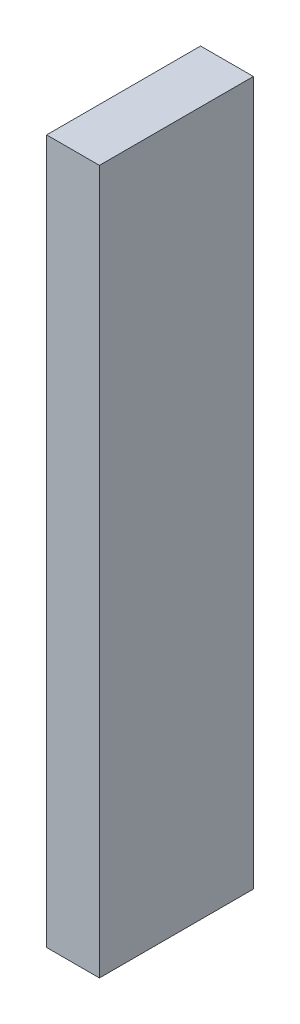
ISO-10303-21;
HEADER;
FILE_DESCRIPTION(('STEP AP214'),'2;1');
FILE_NAME('part.step','',(''),(''),'','','');
FILE_SCHEMA(('AUTOMOTIVE_DESIGN { 1 0 10303 214 1 1 1 1 }'));
ENDSEC;
DATA;
#1=APPLICATION_CONTEXT('core data for automotive mechanical design processes');
#2=APPLICATION_PROTOCOL_DEFINITION('international standard','automotive_design',2000,#1);
#3=PRODUCT_CONTEXT('',#1,'mechanical');
#4=PRODUCT('Part','Part','',(#3));
#5=PRODUCT_RELATED_PRODUCT_CATEGORY('part','',(#4));
#6=PRODUCT_DEFINITION_FORMATION('','',#4);
#7=PRODUCT_DEFINITION_CONTEXT('part definition',#1,'design');
#8=PRODUCT_DEFINITION('design','',#6,#7);
#9=PRODUCT_DEFINITION_SHAPE('','',#8);
#10=(LENGTH_UNIT() NAMED_UNIT(*) SI_UNIT(.MILLI.,.METRE.));
#11=(NAMED_UNIT(*) PLANE_ANGLE_UNIT() SI_UNIT($,.RADIAN.));
#12=(NAMED_UNIT(*) SI_UNIT($,.STERADIAN.) SOLID_ANGLE_UNIT());
#13=UNCERTAINTY_MEASURE_WITH_UNIT(LENGTH_MEASURE(1.E-05),#10,'distance_accuracy_value','');
#14=(GEOMETRIC_REPRESENTATION_CONTEXT(3) GLOBAL_UNCERTAINTY_ASSIGNED_CONTEXT((#13)) GLOBAL_UNIT_ASSIGNED_CONTEXT((#10,
#11,#12)) REPRESENTATION_CONTEXT('',''));
#15=CARTESIAN_POINT('',(0.,0.,0.));
#16=DIRECTION('',(0.,0.,1.));
#17=DIRECTION('',(1.,0.,0.));
#18=AXIS2_PLACEMENT_3D('',#15,#16,#17);
#19=CARTESIAN_POINT('',(-10.8340585797146,80.,-105.756692970029));
#20=DIRECTION('',(-1.,0.,0.));
#21=DIRECTION('',(0.,0.,1.));
#22=AXIS2_PLACEMENT_3D('',#19,#20,#21);
#23=PLANE('',#22);
#24=DIRECTION('',(0.,0.,-1.));
#25=VECTOR('',#24,1.);
#26=CARTESIAN_POINT('',(-10.8340585797146,0.,-105.756692970029));
#27=LINE('',#26,#25);
#28=CARTESIAN_POINT('',(-10.8340585797146,0.,-88.2566929700289));
#29=VERTEX_POINT('',#28);
#30=CARTESIAN_POINT('',(-10.8340585797146,0.,-105.756692970029));
#31=VERTEX_POINT('',#30);
#32=EDGE_CURVE('E99',#29,#31,#27,.T.);
#33=ORIENTED_EDGE('',*,*,#32,.T.);
#34=DIRECTION('',(0.,-1.,0.));
#35=VECTOR('',#34,1.);
#36=CARTESIAN_POINT('',(-10.8340585797146,80.,-105.756692970029));
#37=LINE('',#36,#35);
#38=CARTESIAN_POINT('',(-10.8340585797146,80.,-105.756692970029));
#39=VERTEX_POINT('',#38);
#40=EDGE_CURVE('E11',#39,#31,#37,.T.);
#41=ORIENTED_EDGE('',*,*,#40,.F.);
#42=DIRECTION('',(0.,0.,-1.));
#43=VECTOR('',#42,1.);
#44=CARTESIAN_POINT('',(-10.8340585797146,80.,-105.756692970029));
#45=LINE('',#44,#43);
#46=CARTESIAN_POINT('',(-10.8340585797146,80.,-88.2566929700289));
#47=VERTEX_POINT('',#46);
#48=EDGE_CURVE('E87',#47,#39,#45,.T.);
#49=ORIENTED_EDGE('',*,*,#48,.F.);
#50=DIRECTION('',(0.,-1.,0.));
#51=VECTOR('',#50,1.);
#52=CARTESIAN_POINT('',(-10.8340585797146,80.,-88.2566929700289));
#53=LINE('',#52,#51);
#54=EDGE_CURVE('E95',#47,#29,#53,.T.);
#55=ORIENTED_EDGE('',*,*,#54,.T.);
#56=EDGE_LOOP('',(#33,#41,#49,#55));
#57=FACE_BOUND('',#56,.T.);
#58=ADVANCED_FACE('F36',(#57),#23,.F.);
#59=CARTESIAN_POINT('',(-10.8340585797146,80.,-105.756692970029));
#60=DIRECTION('',(0.,0.,1.));
#61=DIRECTION('',(1.,0.,0.));
#62=AXIS2_PLACEMENT_3D('',#59,#60,#61);
#63=PLANE('',#62);
#64=DIRECTION('',(-1.,0.,0.));
#65=VECTOR('',#64,1.);
#66=CARTESIAN_POINT('',(-10.8340585797146,0.,-105.756692970029));
#67=LINE('',#66,#65);
#68=CARTESIAN_POINT('',(-16.8340585797146,0.,-105.756692970029));
#69=VERTEX_POINT('',#68);
#70=EDGE_CURVE('E91',#31,#69,#67,.T.);
#71=ORIENTED_EDGE('',*,*,#70,.T.);
#72=DIRECTION('',(0.,-1.,0.));
#73=VECTOR('',#72,1.);
#74=CARTESIAN_POINT('',(-16.8340585797146,80.,-105.756692970029));
#75=LINE('',#74,#73);
#76=CARTESIAN_POINT('',(-16.8340585797146,80.,-105.756692970029));
#77=VERTEX_POINT('',#76);
#78=EDGE_CURVE('E44',#77,#69,#75,.T.);
#79=ORIENTED_EDGE('',*,*,#78,.F.);
#80=DIRECTION('',(-1.,0.,0.));
#81=VECTOR('',#80,1.);
#82=CARTESIAN_POINT('',(-10.8340585797146,80.,-105.756692970029));
#83=LINE('',#82,#81);
#84=EDGE_CURVE('E82',#39,#77,#83,.T.);
#85=ORIENTED_EDGE('',*,*,#84,.F.);
#86=ORIENTED_EDGE('',*,*,#40,.T.);
#87=EDGE_LOOP('',(#71,#79,#85,#86));
#88=FACE_BOUND('',#87,.T.);
#89=ADVANCED_FACE('F90',(#88),#63,.F.);
#90=CARTESIAN_POINT('',(-16.8340585797146,80.,-105.756692970029));
#91=DIRECTION('',(1.,0.,0.));
#92=DIRECTION('',(0.,0.,-1.));
#93=AXIS2_PLACEMENT_3D('',#90,#91,#92);
#94=PLANE('',#93);
#95=DIRECTION('',(0.,0.,1.));
#96=VECTOR('',#95,1.);
#97=CARTESIAN_POINT('',(-16.8340585797146,0.,-105.756692970029));
#98=LINE('',#97,#96);
#99=CARTESIAN_POINT('',(-16.8340585797146,0.,-88.2566929700289));
#100=VERTEX_POINT('',#99);
#101=EDGE_CURVE('E69',#69,#100,#98,.T.);
#102=ORIENTED_EDGE('',*,*,#101,.T.);
#103=DIRECTION('',(0.,-1.,0.));
#104=VECTOR('',#103,1.);
#105=CARTESIAN_POINT('',(-16.8340585797146,80.,-88.2566929700289));
#106=LINE('',#105,#104);
#107=CARTESIAN_POINT('',(-16.8340585797146,80.,-88.2566929700289));
#108=VERTEX_POINT('',#107);
#109=EDGE_CURVE('E92',#108,#100,#106,.T.);
#110=ORIENTED_EDGE('',*,*,#109,.F.);
#111=DIRECTION('',(0.,0.,1.));
#112=VECTOR('',#111,1.);
#113=CARTESIAN_POINT('',(-16.8340585797146,80.,-105.756692970029));
#114=LINE('',#113,#112);
#115=EDGE_CURVE('E85',#77,#108,#114,.T.);
#116=ORIENTED_EDGE('',*,*,#115,.F.);
#117=ORIENTED_EDGE('',*,*,#78,.T.);
#118=EDGE_LOOP('',(#102,#110,#116,#117));
#119=FACE_BOUND('',#118,.T.);
#120=ADVANCED_FACE('F93',(#119),#94,.F.);
#121=CARTESIAN_POINT('',(-10.8340585797146,80.,-88.2566929700289));
#122=DIRECTION('',(0.,0.,-1.));
#123=DIRECTION('',(-1.,0.,0.));
#124=AXIS2_PLACEMENT_3D('',#121,#122,#123);
#125=PLANE('',#124);
#126=DIRECTION('',(1.,0.,0.));
#127=VECTOR('',#126,1.);
#128=CARTESIAN_POINT('',(-10.8340585797146,0.,-88.2566929700289));
#129=LINE('',#128,#127);
#130=EDGE_CURVE('E75',#100,#29,#129,.T.);
#131=ORIENTED_EDGE('',*,*,#130,.T.);
#132=ORIENTED_EDGE('',*,*,#54,.F.);
#133=DIRECTION('',(1.,0.,0.));
#134=VECTOR('',#133,1.);
#135=CARTESIAN_POINT('',(-10.8340585797146,80.,-88.2566929700289));
#136=LINE('',#135,#134);
#137=EDGE_CURVE('E52',#108,#47,#136,.T.);
#138=ORIENTED_EDGE('',*,*,#137,.F.);
#139=ORIENTED_EDGE('',*,*,#109,.T.);
#140=EDGE_LOOP('',(#131,#132,#138,#139));
#141=FACE_BOUND('',#140,.T.);
#142=ADVANCED_FACE('F106',(#141),#125,.F.);
#143=CARTESIAN_POINT('',(0.,80.,0.));
#144=DIRECTION('',(0.,-1.,0.));
#145=DIRECTION('',(0.,0.,-1.));
#146=AXIS2_PLACEMENT_3D('',#143,#144,#145);
#147=PLANE('',#146);
#148=ORIENTED_EDGE('',*,*,#48,.T.);
#149=ORIENTED_EDGE('',*,*,#84,.T.);
#150=ORIENTED_EDGE('',*,*,#115,.T.);
#151=ORIENTED_EDGE('',*,*,#137,.T.);
#152=EDGE_LOOP('',(#148,#149,#150,#151));
#153=FACE_BOUND('',#152,.T.);
#154=ADVANCED_FACE('F83',(#153),#147,.F.);
#155=CARTESIAN_POINT('',(0.,0.,0.));
#156=DIRECTION('',(0.,-1.,0.));
#157=DIRECTION('',(0.,0.,-1.));
#158=AXIS2_PLACEMENT_3D('',#155,#156,#157);
#159=PLANE('',#158);
#160=ORIENTED_EDGE('',*,*,#32,.F.);
#161=ORIENTED_EDGE('',*,*,#130,.F.);
#162=ORIENTED_EDGE('',*,*,#101,.F.);
#163=ORIENTED_EDGE('',*,*,#70,.F.);
#164=EDGE_LOOP('',(#160,#161,#162,#163));
#165=FACE_BOUND('',#164,.T.);
#166=ADVANCED_FACE('F109',(#165),#159,.T.);
#167=CLOSED_SHELL('',(#58,#89,#120,#142,#154,#166));
#168=MANIFOLD_SOLID_BREP('B2',#167);
#169=ADVANCED_BREP_SHAPE_REPRESENTATION('',(#18,#168),#14);
#170=SHAPE_DEFINITION_REPRESENTATION(#9,#169);
ENDSEC;
END-ISO-10303-21;
